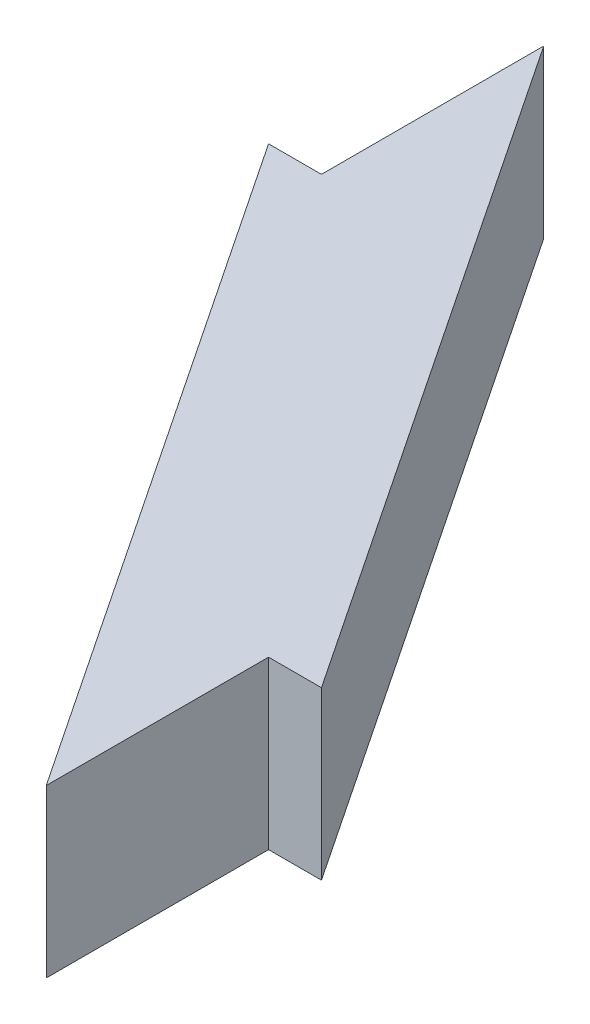
ISO-10303-21;
HEADER;
FILE_DESCRIPTION(('STEP AP214'),'2;1');
FILE_NAME('part.step','',(''),(''),'','','');
FILE_SCHEMA(('AUTOMOTIVE_DESIGN { 1 0 10303 214 1 1 1 1 }'));
ENDSEC;
DATA;
#1=APPLICATION_CONTEXT('core data for automotive mechanical design processes');
#2=APPLICATION_PROTOCOL_DEFINITION('international standard','automotive_design',2000,#1);
#3=PRODUCT_CONTEXT('',#1,'mechanical');
#4=PRODUCT('Part','Part','',(#3));
#5=PRODUCT_RELATED_PRODUCT_CATEGORY('part','',(#4));
#6=PRODUCT_DEFINITION_FORMATION('','',#4);
#7=PRODUCT_DEFINITION_CONTEXT('part definition',#1,'design');
#8=PRODUCT_DEFINITION('design','',#6,#7);
#9=PRODUCT_DEFINITION_SHAPE('','',#8);
#10=(LENGTH_UNIT() NAMED_UNIT(*) SI_UNIT(.MILLI.,.METRE.));
#11=(NAMED_UNIT(*) PLANE_ANGLE_UNIT() SI_UNIT($,.RADIAN.));
#12=(NAMED_UNIT(*) SI_UNIT($,.STERADIAN.) SOLID_ANGLE_UNIT());
#13=UNCERTAINTY_MEASURE_WITH_UNIT(LENGTH_MEASURE(1.E-05),#10,'distance_accuracy_value','');
#14=(GEOMETRIC_REPRESENTATION_CONTEXT(3) GLOBAL_UNCERTAINTY_ASSIGNED_CONTEXT((#13)) GLOBAL_UNIT_ASSIGNED_CONTEXT((#10,
#11,#12)) REPRESENTATION_CONTEXT('',''));
#15=CARTESIAN_POINT('',(0.,0.,0.));
#16=DIRECTION('',(0.,0.,1.));
#17=DIRECTION('',(1.,0.,0.));
#18=AXIS2_PLACEMENT_3D('',#15,#16,#17);
#19=CARTESIAN_POINT('',(22.3774,9.525,25.4));
#20=DIRECTION('',(-1.,0.,0.));
#21=DIRECTION('',(0.,0.,1.));
#22=AXIS2_PLACEMENT_3D('',#19,#20,#21);
#23=PLANE('',#22);
#24=DIRECTION('',(0.,0.,-1.));
#25=VECTOR('',#24,1.);
#26=CARTESIAN_POINT('',(22.3774,-9.525,25.4));
#27=LINE('',#26,#25);
#28=CARTESIAN_POINT('',(22.3774,-9.525,50.8));
#29=VERTEX_POINT('',#28);
#30=CARTESIAN_POINT('',(22.3774,-9.525,25.4));
#31=VERTEX_POINT('',#30);
#32=EDGE_CURVE('E134',#29,#31,#27,.T.);
#33=ORIENTED_EDGE('',*,*,#32,.T.);
#34=DIRECTION('',(0.,-1.,0.));
#35=VECTOR('',#34,1.);
#36=CARTESIAN_POINT('',(22.3774,9.525,25.4));
#37=LINE('',#36,#35);
#38=CARTESIAN_POINT('',(22.3774,9.525,25.4));
#39=VERTEX_POINT('',#38);
#40=EDGE_CURVE('E11',#39,#31,#37,.T.);
#41=ORIENTED_EDGE('',*,*,#40,.F.);
#42=DIRECTION('',(0.,0.,-1.));
#43=VECTOR('',#42,1.);
#44=CARTESIAN_POINT('',(22.3774,9.525,25.4));
#45=LINE('',#44,#43);
#46=CARTESIAN_POINT('',(22.3774,9.525,50.8));
#47=VERTEX_POINT('',#46);
#48=EDGE_CURVE('E150',#47,#39,#45,.T.);
#49=ORIENTED_EDGE('',*,*,#48,.F.);
#50=DIRECTION('',(0.,-1.,0.));
#51=VECTOR('',#50,1.);
#52=CARTESIAN_POINT('',(22.3774,9.525,50.8));
#53=LINE('',#52,#51);
#54=EDGE_CURVE('E130',#47,#29,#53,.T.);
#55=ORIENTED_EDGE('',*,*,#54,.T.);
#56=EDGE_LOOP('',(#33,#41,#49,#55));
#57=FACE_BOUND('',#56,.T.);
#58=ADVANCED_FACE('F45',(#57),#23,.F.);
#59=CARTESIAN_POINT('',(28.4226,9.525,25.4));
#60=DIRECTION('',(0.,0.,-1.));
#61=DIRECTION('',(-1.,0.,0.));
#62=AXIS2_PLACEMENT_3D('',#59,#60,#61);
#63=PLANE('',#62);
#64=DIRECTION('',(1.,0.,0.));
#65=VECTOR('',#64,1.);
#66=CARTESIAN_POINT('',(28.4226,-9.525,25.4));
#67=LINE('',#66,#65);
#68=CARTESIAN_POINT('',(28.4226,-9.525,25.4));
#69=VERTEX_POINT('',#68);
#70=EDGE_CURVE('E138',#31,#69,#67,.T.);
#71=ORIENTED_EDGE('',*,*,#70,.T.);
#72=DIRECTION('',(0.,-1.,0.));
#73=VECTOR('',#72,1.);
#74=CARTESIAN_POINT('',(28.4226,9.525,25.4));
#75=LINE('',#74,#73);
#76=CARTESIAN_POINT('',(28.4226,9.525,25.4));
#77=VERTEX_POINT('',#76);
#78=EDGE_CURVE('E54',#77,#69,#75,.T.);
#79=ORIENTED_EDGE('',*,*,#78,.F.);
#80=DIRECTION('',(1.,0.,0.));
#81=VECTOR('',#80,1.);
#82=CARTESIAN_POINT('',(28.4226,9.525,25.4));
#83=LINE('',#82,#81);
#84=EDGE_CURVE('E99',#39,#77,#83,.T.);
#85=ORIENTED_EDGE('',*,*,#84,.F.);
#86=ORIENTED_EDGE('',*,*,#40,.T.);
#87=EDGE_LOOP('',(#71,#79,#85,#86));
#88=FACE_BOUND('',#87,.T.);
#89=ADVANCED_FACE('F178',(#88),#63,.F.);
#90=CARTESIAN_POINT('',(-22.3774,9.525,-50.8));
#91=DIRECTION('',(-0.832050294337844,0.,0.554700196225229));
#92=DIRECTION('',(0.554700196225229,0.,0.832050294337844));
#93=AXIS2_PLACEMENT_3D('',#90,#91,#92);
#94=PLANE('',#93);
#95=DIRECTION('',(-0.554700196225229,0.,-0.832050294337844));
#96=VECTOR('',#95,1.);
#97=CARTESIAN_POINT('',(-22.3774,-9.525,-50.8));
#98=LINE('',#97,#96);
#99=CARTESIAN_POINT('',(-22.3774,-9.525,-50.8));
#100=VERTEX_POINT('',#99);
#101=EDGE_CURVE('E141',#69,#100,#98,.T.);
#102=ORIENTED_EDGE('',*,*,#101,.T.);
#103=DIRECTION('',(0.,-1.,0.));
#104=VECTOR('',#103,1.);
#105=CARTESIAN_POINT('',(-22.3774,9.525,-50.8));
#106=LINE('',#105,#104);
#107=CARTESIAN_POINT('',(-22.3774,9.525,-50.8));
#108=VERTEX_POINT('',#107);
#109=EDGE_CURVE('E123',#108,#100,#106,.T.);
#110=ORIENTED_EDGE('',*,*,#109,.F.);
#111=DIRECTION('',(-0.554700196225229,0.,-0.832050294337844));
#112=VECTOR('',#111,1.);
#113=CARTESIAN_POINT('',(-22.3774,9.525,-50.8));
#114=LINE('',#113,#112);
#115=EDGE_CURVE('E112',#77,#108,#114,.T.);
#116=ORIENTED_EDGE('',*,*,#115,.F.);
#117=ORIENTED_EDGE('',*,*,#78,.T.);
#118=EDGE_LOOP('',(#102,#110,#116,#117));
#119=FACE_BOUND('',#118,.T.);
#120=ADVANCED_FACE('F160',(#119),#94,.F.);
#121=CARTESIAN_POINT('',(-22.3774,9.525,-50.8));
#122=DIRECTION('',(1.,0.,0.));
#123=DIRECTION('',(0.,0.,-1.));
#124=AXIS2_PLACEMENT_3D('',#121,#122,#123);
#125=PLANE('',#124);
#126=DIRECTION('',(0.,0.,1.));
#127=VECTOR('',#126,1.);
#128=CARTESIAN_POINT('',(-22.3774,-9.525,-50.8));
#129=LINE('',#128,#127);
#130=CARTESIAN_POINT('',(-22.3774,-9.525,-25.4));
#131=VERTEX_POINT('',#130);
#132=EDGE_CURVE('E121',#100,#131,#129,.T.);
#133=ORIENTED_EDGE('',*,*,#132,.T.);
#134=DIRECTION('',(0.,-1.,0.));
#135=VECTOR('',#134,1.);
#136=CARTESIAN_POINT('',(-22.3774,9.525,-25.4));
#137=LINE('',#136,#135);
#138=CARTESIAN_POINT('',(-22.3774,9.525,-25.4));
#139=VERTEX_POINT('',#138);
#140=EDGE_CURVE('E118',#139,#131,#137,.T.);
#141=ORIENTED_EDGE('',*,*,#140,.F.);
#142=DIRECTION('',(0.,0.,1.));
#143=VECTOR('',#142,1.);
#144=CARTESIAN_POINT('',(-22.3774,9.525,-50.8));
#145=LINE('',#144,#143);
#146=EDGE_CURVE('E106',#108,#139,#145,.T.);
#147=ORIENTED_EDGE('',*,*,#146,.F.);
#148=ORIENTED_EDGE('',*,*,#109,.T.);
#149=EDGE_LOOP('',(#133,#141,#147,#148));
#150=FACE_BOUND('',#149,.T.);
#151=ADVANCED_FACE('F119',(#150),#125,.F.);
#152=CARTESIAN_POINT('',(-22.3774,9.525,-25.4));
#153=DIRECTION('',(0.,0.,1.));
#154=DIRECTION('',(1.,0.,0.));
#155=AXIS2_PLACEMENT_3D('',#152,#153,#154);
#156=PLANE('',#155);
#157=DIRECTION('',(-1.,0.,0.));
#158=VECTOR('',#157,1.);
#159=CARTESIAN_POINT('',(-22.3774,-9.525,-25.4));
#160=LINE('',#159,#158);
#161=CARTESIAN_POINT('',(-28.4226,-9.525,-25.4));
#162=VERTEX_POINT('',#161);
#163=EDGE_CURVE('E85',#131,#162,#160,.T.);
#164=ORIENTED_EDGE('',*,*,#163,.T.);
#165=DIRECTION('',(0.,-1.,0.));
#166=VECTOR('',#165,1.);
#167=CARTESIAN_POINT('',(-28.4226,9.525,-25.4));
#168=LINE('',#167,#166);
#169=CARTESIAN_POINT('',(-28.4226,9.525,-25.4));
#170=VERTEX_POINT('',#169);
#171=EDGE_CURVE('E124',#170,#162,#168,.T.);
#172=ORIENTED_EDGE('',*,*,#171,.F.);
#173=DIRECTION('',(-1.,0.,0.));
#174=VECTOR('',#173,1.);
#175=CARTESIAN_POINT('',(-22.3774,9.525,-25.4));
#176=LINE('',#175,#174);
#177=EDGE_CURVE('E110',#139,#170,#176,.T.);
#178=ORIENTED_EDGE('',*,*,#177,.F.);
#179=ORIENTED_EDGE('',*,*,#140,.T.);
#180=EDGE_LOOP('',(#164,#172,#178,#179));
#181=FACE_BOUND('',#180,.T.);
#182=ADVANCED_FACE('F126',(#181),#156,.F.);
#183=CARTESIAN_POINT('',(22.3774,9.525,50.8));
#184=DIRECTION('',(0.832050294337844,0.,-0.554700196225229));
#185=DIRECTION('',(-0.554700196225229,0.,-0.832050294337844));
#186=AXIS2_PLACEMENT_3D('',#183,#184,#185);
#187=PLANE('',#186);
#188=DIRECTION('',(0.554700196225229,0.,0.832050294337844));
#189=VECTOR('',#188,1.);
#190=CARTESIAN_POINT('',(22.3774,-9.525,50.8));
#191=LINE('',#190,#189);
#192=EDGE_CURVE('E91',#162,#29,#191,.T.);
#193=ORIENTED_EDGE('',*,*,#192,.T.);
#194=ORIENTED_EDGE('',*,*,#54,.F.);
#195=DIRECTION('',(0.554700196225229,0.,0.832050294337844));
#196=VECTOR('',#195,1.);
#197=CARTESIAN_POINT('',(22.3774,9.525,50.8));
#198=LINE('',#197,#196);
#199=EDGE_CURVE('E62',#170,#47,#198,.T.);
#200=ORIENTED_EDGE('',*,*,#199,.F.);
#201=ORIENTED_EDGE('',*,*,#171,.T.);
#202=EDGE_LOOP('',(#193,#194,#200,#201));
#203=FACE_BOUND('',#202,.T.);
#204=ADVANCED_FACE('F167',(#203),#187,.F.);
#205=CARTESIAN_POINT('',(0.,9.525,0.));
#206=DIRECTION('',(0.,-1.,0.));
#207=DIRECTION('',(0.,0.,-1.));
#208=AXIS2_PLACEMENT_3D('',#205,#206,#207);
#209=PLANE('',#208);
#210=ORIENTED_EDGE('',*,*,#48,.T.);
#211=ORIENTED_EDGE('',*,*,#84,.T.);
#212=ORIENTED_EDGE('',*,*,#115,.T.);
#213=ORIENTED_EDGE('',*,*,#146,.T.);
#214=ORIENTED_EDGE('',*,*,#177,.T.);
#215=ORIENTED_EDGE('',*,*,#199,.T.);
#216=EDGE_LOOP('',(#210,#211,#212,#213,#214,#215));
#217=FACE_BOUND('',#216,.T.);
#218=ADVANCED_FACE('F108',(#217),#209,.F.);
#219=CARTESIAN_POINT('',(0.,-9.525,0.));
#220=DIRECTION('',(0.,-1.,0.));
#221=DIRECTION('',(0.,0.,-1.));
#222=AXIS2_PLACEMENT_3D('',#219,#220,#221);
#223=PLANE('',#222);
#224=ORIENTED_EDGE('',*,*,#32,.F.);
#225=ORIENTED_EDGE('',*,*,#192,.F.);
#226=ORIENTED_EDGE('',*,*,#163,.F.);
#227=ORIENTED_EDGE('',*,*,#132,.F.);
#228=ORIENTED_EDGE('',*,*,#101,.F.);
#229=ORIENTED_EDGE('',*,*,#70,.F.);
#230=EDGE_LOOP('',(#224,#225,#226,#227,#228,#229));
#231=FACE_BOUND('',#230,.T.);
#232=ADVANCED_FACE('F163',(#231),#223,.T.);
#233=CLOSED_SHELL('',(#58,#89,#120,#151,#182,#204,#218,#232));
#234=MANIFOLD_SOLID_BREP('B2',#233);
#235=ADVANCED_BREP_SHAPE_REPRESENTATION('',(#18,#234),#14);
#236=SHAPE_DEFINITION_REPRESENTATION(#9,#235);
ENDSEC;
END-ISO-10303-21;
